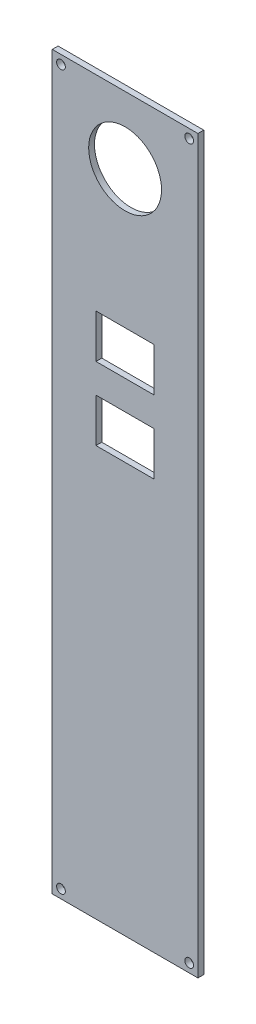
ISO-10303-21;
HEADER;
FILE_DESCRIPTION(('STEP AP214'),'2;1');
FILE_NAME('part.step','',(''),(''),'','','');
FILE_SCHEMA(('AUTOMOTIVE_DESIGN { 1 0 10303 214 1 1 1 1 }'));
ENDSEC;
DATA;
#1=APPLICATION_CONTEXT('core data for automotive mechanical design processes');
#2=APPLICATION_PROTOCOL_DEFINITION('international standard','automotive_design',2000,#1);
#3=PRODUCT_CONTEXT('',#1,'mechanical');
#4=PRODUCT('Part','Part','',(#3));
#5=PRODUCT_RELATED_PRODUCT_CATEGORY('part','',(#4));
#6=PRODUCT_DEFINITION_FORMATION('','',#4);
#7=PRODUCT_DEFINITION_CONTEXT('part definition',#1,'design');
#8=PRODUCT_DEFINITION('design','',#6,#7);
#9=PRODUCT_DEFINITION_SHAPE('','',#8);
#10=(LENGTH_UNIT() NAMED_UNIT(*) SI_UNIT(.MILLI.,.METRE.));
#11=(NAMED_UNIT(*) PLANE_ANGLE_UNIT() SI_UNIT($,.RADIAN.));
#12=(NAMED_UNIT(*) SI_UNIT($,.STERADIAN.) SOLID_ANGLE_UNIT());
#13=UNCERTAINTY_MEASURE_WITH_UNIT(LENGTH_MEASURE(1.E-05),#10,'distance_accuracy_value','');
#14=(GEOMETRIC_REPRESENTATION_CONTEXT(3) GLOBAL_UNCERTAINTY_ASSIGNED_CONTEXT((#13)) GLOBAL_UNIT_ASSIGNED_CONTEXT((#10,
#11,#12)) REPRESENTATION_CONTEXT('',''));
#15=CARTESIAN_POINT('',(0.,0.,0.));
#16=DIRECTION('',(0.,0.,1.));
#17=DIRECTION('',(1.,0.,0.));
#18=AXIS2_PLACEMENT_3D('',#15,#16,#17);
#19=CARTESIAN_POINT('',(25.,-110.746211437382,2.));
#20=DIRECTION('',(-1.,0.,0.));
#21=DIRECTION('',(0.,0.,1.));
#22=AXIS2_PLACEMENT_3D('',#19,#20,#21);
#23=PLANE('',#22);
#24=DIRECTION('',(0.,1.,0.));
#25=VECTOR('',#24,1.);
#26=CARTESIAN_POINT('',(25.,-110.746211437382,0.));
#27=LINE('',#26,#25);
#28=CARTESIAN_POINT('',(25.,-110.746211437382,0.));
#29=VERTEX_POINT('',#28);
#30=CARTESIAN_POINT('',(25.,140.253788562618,0.));
#31=VERTEX_POINT('',#30);
#32=EDGE_CURVE('E263',#29,#31,#27,.T.);
#33=ORIENTED_EDGE('',*,*,#32,.T.);
#34=DIRECTION('',(0.,0.,-1.));
#35=VECTOR('',#34,1.);
#36=CARTESIAN_POINT('',(25.,140.253788562618,2.));
#37=LINE('',#36,#35);
#38=CARTESIAN_POINT('',(25.,140.253788562618,2.));
#39=VERTEX_POINT('',#38);
#40=EDGE_CURVE('E11',#39,#31,#37,.T.);
#41=ORIENTED_EDGE('',*,*,#40,.F.);
#42=DIRECTION('',(0.,1.,0.));
#43=VECTOR('',#42,1.);
#44=CARTESIAN_POINT('',(25.,-110.746211437382,2.));
#45=LINE('',#44,#43);
#46=CARTESIAN_POINT('',(25.,-110.746211437382,2.));
#47=VERTEX_POINT('',#46);
#48=EDGE_CURVE('E267',#47,#39,#45,.T.);
#49=ORIENTED_EDGE('',*,*,#48,.F.);
#50=DIRECTION('',(0.,0.,-1.));
#51=VECTOR('',#50,1.);
#52=CARTESIAN_POINT('',(25.,-110.746211437382,2.));
#53=LINE('',#52,#51);
#54=EDGE_CURVE('E283',#47,#29,#53,.T.);
#55=ORIENTED_EDGE('',*,*,#54,.T.);
#56=EDGE_LOOP('',(#33,#41,#49,#55));
#57=FACE_BOUND('',#56,.T.);
#58=ADVANCED_FACE('F43',(#57),#23,.F.);
#59=CARTESIAN_POINT('',(25.,140.253788562618,2.));
#60=DIRECTION('',(0.,-1.,0.));
#61=DIRECTION('',(0.,0.,-1.));
#62=AXIS2_PLACEMENT_3D('',#59,#60,#61);
#63=PLANE('',#62);
#64=DIRECTION('',(-1.,0.,0.));
#65=VECTOR('',#64,1.);
#66=CARTESIAN_POINT('',(25.,140.253788562618,0.));
#67=LINE('',#66,#65);
#68=CARTESIAN_POINT('',(-25.,140.253788562618,0.));
#69=VERTEX_POINT('',#68);
#70=EDGE_CURVE('E287',#31,#69,#67,.T.);
#71=ORIENTED_EDGE('',*,*,#70,.T.);
#72=DIRECTION('',(0.,0.,-1.));
#73=VECTOR('',#72,1.);
#74=CARTESIAN_POINT('',(-25.,140.253788562618,2.));
#75=LINE('',#74,#73);
#76=CARTESIAN_POINT('',(-25.,140.253788562618,2.));
#77=VERTEX_POINT('',#76);
#78=EDGE_CURVE('E51',#77,#69,#75,.T.);
#79=ORIENTED_EDGE('',*,*,#78,.F.);
#80=DIRECTION('',(-1.,0.,0.));
#81=VECTOR('',#80,1.);
#82=CARTESIAN_POINT('',(25.,140.253788562618,2.));
#83=LINE('',#82,#81);
#84=EDGE_CURVE('E271',#39,#77,#83,.T.);
#85=ORIENTED_EDGE('',*,*,#84,.F.);
#86=ORIENTED_EDGE('',*,*,#40,.T.);
#87=EDGE_LOOP('',(#71,#79,#85,#86));
#88=FACE_BOUND('',#87,.T.);
#89=ADVANCED_FACE('F309',(#88),#63,.F.);
#90=CARTESIAN_POINT('',(-25.,-110.746211437382,2.));
#91=DIRECTION('',(-1.,0.,0.));
#92=DIRECTION('',(0.,0.,1.));
#93=AXIS2_PLACEMENT_3D('',#90,#91,#92);
#94=PLANE('',#93);
#95=DIRECTION('',(0.,1.,0.));
#96=VECTOR('',#95,1.);
#97=CARTESIAN_POINT('',(-25.,-110.746211437382,0.));
#98=LINE('',#97,#96);
#99=CARTESIAN_POINT('',(-25.,-110.746211437382,0.));
#100=VERTEX_POINT('',#99);
#101=EDGE_CURVE('E291',#100,#69,#98,.T.);
#102=ORIENTED_EDGE('',*,*,#101,.F.);
#103=DIRECTION('',(0.,0.,-1.));
#104=VECTOR('',#103,1.);
#105=CARTESIAN_POINT('',(-25.,-110.746211437382,2.));
#106=LINE('',#105,#104);
#107=CARTESIAN_POINT('',(-25.,-110.746211437382,2.));
#108=VERTEX_POINT('',#107);
#109=EDGE_CURVE('E300',#108,#100,#106,.T.);
#110=ORIENTED_EDGE('',*,*,#109,.F.);
#111=DIRECTION('',(0.,1.,0.));
#112=VECTOR('',#111,1.);
#113=CARTESIAN_POINT('',(-25.,-110.746211437382,2.));
#114=LINE('',#113,#112);
#115=EDGE_CURVE('E275',#108,#77,#114,.T.);
#116=ORIENTED_EDGE('',*,*,#115,.T.);
#117=ORIENTED_EDGE('',*,*,#78,.T.);
#118=EDGE_LOOP('',(#102,#110,#116,#117));
#119=FACE_BOUND('',#118,.T.);
#120=ADVANCED_FACE('F306',(#119),#94,.T.);
#121=CARTESIAN_POINT('',(25.,-110.746211437382,2.));
#122=DIRECTION('',(0.,-1.,0.));
#123=DIRECTION('',(0.,0.,-1.));
#124=AXIS2_PLACEMENT_3D('',#121,#122,#123);
#125=PLANE('',#124);
#126=DIRECTION('',(-1.,0.,0.));
#127=VECTOR('',#126,1.);
#128=CARTESIAN_POINT('',(25.,-110.746211437382,0.));
#129=LINE('',#128,#127);
#130=EDGE_CURVE('E272',#29,#100,#129,.T.);
#131=ORIENTED_EDGE('',*,*,#130,.F.);
#132=ORIENTED_EDGE('',*,*,#54,.F.);
#133=DIRECTION('',(-1.,0.,0.));
#134=VECTOR('',#133,1.);
#135=CARTESIAN_POINT('',(25.,-110.746211437382,2.));
#136=LINE('',#135,#134);
#137=EDGE_CURVE('E279',#47,#108,#136,.T.);
#138=ORIENTED_EDGE('',*,*,#137,.T.);
#139=ORIENTED_EDGE('',*,*,#109,.T.);
#140=EDGE_LOOP('',(#131,#132,#138,#139));
#141=FACE_BOUND('',#140,.T.);
#142=ADVANCED_FACE('F316',(#141),#125,.T.);
#143=CARTESIAN_POINT('',(0.,0.,2.));
#144=DIRECTION('',(0.,0.,1.));
#145=DIRECTION('',(1.,0.,0.));
#146=AXIS2_PLACEMENT_3D('',#143,#144,#145);
#147=PLANE('',#146);
#148=DIRECTION('',(0.,-1.,0.));
#149=VECTOR('',#148,1.);
#150=CARTESIAN_POINT('',(10.,55.,2.));
#151=LINE('',#150,#149);
#152=CARTESIAN_POINT('',(10.,70.,2.));
#153=VERTEX_POINT('',#152);
#154=CARTESIAN_POINT('',(10.,55.,2.));
#155=VERTEX_POINT('',#154);
#156=EDGE_CURVE('E136',#153,#155,#151,.T.);
#157=ORIENTED_EDGE('',*,*,#156,.T.);
#158=DIRECTION('',(-1.,0.,0.));
#159=VECTOR('',#158,1.);
#160=CARTESIAN_POINT('',(-10.,55.,2.));
#161=LINE('',#160,#159);
#162=CARTESIAN_POINT('',(-10.,55.,2.));
#163=VERTEX_POINT('',#162);
#164=EDGE_CURVE('E148',#155,#163,#161,.T.);
#165=ORIENTED_EDGE('',*,*,#164,.T.);
#166=DIRECTION('',(0.,1.,0.));
#167=VECTOR('',#166,1.);
#168=CARTESIAN_POINT('',(-10.,55.,2.));
#169=LINE('',#168,#167);
#170=CARTESIAN_POINT('',(-10.,70.,2.));
#171=VERTEX_POINT('',#170);
#172=EDGE_CURVE('E58',#163,#171,#169,.T.);
#173=ORIENTED_EDGE('',*,*,#172,.T.);
#174=DIRECTION('',(1.,0.,0.));
#175=VECTOR('',#174,1.);
#176=CARTESIAN_POINT('',(-10.,70.,2.));
#177=LINE('',#176,#175);
#178=EDGE_CURVE('E145',#171,#153,#177,.T.);
#179=ORIENTED_EDGE('',*,*,#178,.T.);
#180=EDGE_LOOP('',(#157,#165,#173,#179));
#181=FACE_BOUND('',#180,.T.);
#182=DIRECTION('',(0.,-1.,0.));
#183=VECTOR('',#182,1.);
#184=CARTESIAN_POINT('',(10.,30.,2.));
#185=LINE('',#184,#183);
#186=CARTESIAN_POINT('',(10.,45.,2.));
#187=VERTEX_POINT('',#186);
#188=CARTESIAN_POINT('',(10.,30.,2.));
#189=VERTEX_POINT('',#188);
#190=EDGE_CURVE('E205',#187,#189,#185,.T.);
#191=ORIENTED_EDGE('',*,*,#190,.T.);
#192=DIRECTION('',(-1.,0.,0.));
#193=VECTOR('',#192,1.);
#194=CARTESIAN_POINT('',(-10.,30.,2.));
#195=LINE('',#194,#193);
#196=CARTESIAN_POINT('',(-10.,30.,2.));
#197=VERTEX_POINT('',#196);
#198=EDGE_CURVE('E220',#189,#197,#195,.T.);
#199=ORIENTED_EDGE('',*,*,#198,.T.);
#200=DIRECTION('',(0.,1.,0.));
#201=VECTOR('',#200,1.);
#202=CARTESIAN_POINT('',(-10.,30.,2.));
#203=LINE('',#202,#201);
#204=CARTESIAN_POINT('',(-10.,45.,2.));
#205=VERTEX_POINT('',#204);
#206=EDGE_CURVE('E66',#197,#205,#203,.T.);
#207=ORIENTED_EDGE('',*,*,#206,.T.);
#208=DIRECTION('',(1.,0.,0.));
#209=VECTOR('',#208,1.);
#210=CARTESIAN_POINT('',(-10.,45.,2.));
#211=LINE('',#210,#209);
#212=EDGE_CURVE('E190',#205,#187,#211,.T.);
#213=ORIENTED_EDGE('',*,*,#212,.T.);
#214=EDGE_LOOP('',(#191,#199,#207,#213));
#215=FACE_BOUND('',#214,.T.);
#216=CARTESIAN_POINT('',(22.,137.253788562618,2.));
#217=DIRECTION('',(0.,0.,1.));
#218=DIRECTION('',(1.,0.,0.));
#219=AXIS2_PLACEMENT_3D('',#216,#217,#218);
#220=CIRCLE('',#219,1.5);
#221=CARTESIAN_POINT('',(23.5,137.253788562618,2.));
#222=VERTEX_POINT('',#221);
#223=EDGE_CURVE('E235',#222,#222,#220,.T.);
#224=ORIENTED_EDGE('',*,*,#223,.F.);
#225=EDGE_LOOP('',(#224));
#226=FACE_BOUND('',#225,.T.);
#227=CARTESIAN_POINT('',(-22.,-107.746211437382,2.));
#228=DIRECTION('',(0.,0.,1.));
#229=DIRECTION('',(1.,0.,0.));
#230=AXIS2_PLACEMENT_3D('',#227,#228,#229);
#231=CIRCLE('',#230,1.5);
#232=CARTESIAN_POINT('',(-20.5,-107.746211437382,2.));
#233=VERTEX_POINT('',#232);
#234=EDGE_CURVE('E244',#233,#233,#231,.T.);
#235=ORIENTED_EDGE('',*,*,#234,.F.);
#236=EDGE_LOOP('',(#235));
#237=FACE_BOUND('',#236,.T.);
#238=CARTESIAN_POINT('',(22.,-107.746211437382,2.));
#239=DIRECTION('',(0.,0.,1.));
#240=DIRECTION('',(1.,0.,0.));
#241=AXIS2_PLACEMENT_3D('',#238,#239,#240);
#242=CIRCLE('',#241,1.5);
#243=CARTESIAN_POINT('',(23.5,-107.746211437382,2.));
#244=VERTEX_POINT('',#243);
#245=EDGE_CURVE('E227',#244,#244,#242,.T.);
#246=ORIENTED_EDGE('',*,*,#245,.F.);
#247=EDGE_LOOP('',(#246));
#248=FACE_BOUND('',#247,.T.);
#249=CARTESIAN_POINT('',(-22.,137.253788562618,2.));
#250=DIRECTION('',(0.,0.,1.));
#251=DIRECTION('',(1.,0.,0.));
#252=AXIS2_PLACEMENT_3D('',#249,#250,#251);
#253=CIRCLE('',#252,1.5);
#254=CARTESIAN_POINT('',(-20.5,137.253788562618,2.));
#255=VERTEX_POINT('',#254);
#256=EDGE_CURVE('E239',#255,#255,#253,.T.);
#257=ORIENTED_EDGE('',*,*,#256,.F.);
#258=EDGE_LOOP('',(#257));
#259=FACE_BOUND('',#258,.T.);
#260=CARTESIAN_POINT('',(0.,117.253788562618,2.));
#261=DIRECTION('',(0.,0.,1.));
#262=DIRECTION('',(1.,0.,0.));
#263=AXIS2_PLACEMENT_3D('',#260,#261,#262);
#264=CIRCLE('',#263,12.5);
#265=CARTESIAN_POINT('',(12.5,117.253788562618,2.));
#266=VERTEX_POINT('',#265);
#267=EDGE_CURVE('E255',#266,#266,#264,.F.);
#268=ORIENTED_EDGE('',*,*,#267,.T.);
#269=EDGE_LOOP('',(#268));
#270=FACE_BOUND('',#269,.T.);
#271=ORIENTED_EDGE('',*,*,#48,.T.);
#272=ORIENTED_EDGE('',*,*,#84,.T.);
#273=ORIENTED_EDGE('',*,*,#115,.F.);
#274=ORIENTED_EDGE('',*,*,#137,.F.);
#275=EDGE_LOOP('',(#271,#272,#273,#274));
#276=FACE_BOUND('',#275,.T.);
#277=ADVANCED_FACE('F153',(#181,#215,#226,#237,#248,#259,#270,#276),#147,.T.);
#278=CARTESIAN_POINT('',(0.,0.,0.));
#279=DIRECTION('',(0.,0.,1.));
#280=DIRECTION('',(1.,0.,0.));
#281=AXIS2_PLACEMENT_3D('',#278,#279,#280);
#282=PLANE('',#281);
#283=DIRECTION('',(-1.,0.,0.));
#284=VECTOR('',#283,1.);
#285=CARTESIAN_POINT('',(-10.,55.,0.));
#286=LINE('',#285,#284);
#287=CARTESIAN_POINT('',(10.,55.,0.));
#288=VERTEX_POINT('',#287);
#289=CARTESIAN_POINT('',(-10.,55.,0.));
#290=VERTEX_POINT('',#289);
#291=EDGE_CURVE('E170',#288,#290,#286,.T.);
#292=ORIENTED_EDGE('',*,*,#291,.F.);
#293=DIRECTION('',(0.,-1.,0.));
#294=VECTOR('',#293,1.);
#295=CARTESIAN_POINT('',(10.,55.,0.));
#296=LINE('',#295,#294);
#297=CARTESIAN_POINT('',(10.,70.,0.));
#298=VERTEX_POINT('',#297);
#299=EDGE_CURVE('E139',#298,#288,#296,.T.);
#300=ORIENTED_EDGE('',*,*,#299,.F.);
#301=DIRECTION('',(1.,0.,0.));
#302=VECTOR('',#301,1.);
#303=CARTESIAN_POINT('',(-10.,70.,0.));
#304=LINE('',#303,#302);
#305=CARTESIAN_POINT('',(-10.,70.,0.));
#306=VERTEX_POINT('',#305);
#307=EDGE_CURVE('E157',#306,#298,#304,.T.);
#308=ORIENTED_EDGE('',*,*,#307,.F.);
#309=DIRECTION('',(0.,1.,0.));
#310=VECTOR('',#309,1.);
#311=CARTESIAN_POINT('',(-10.,55.,0.));
#312=LINE('',#311,#310);
#313=EDGE_CURVE('E161',#290,#306,#312,.T.);
#314=ORIENTED_EDGE('',*,*,#313,.F.);
#315=EDGE_LOOP('',(#292,#300,#308,#314));
#316=FACE_BOUND('',#315,.T.);
#317=DIRECTION('',(-1.,0.,0.));
#318=VECTOR('',#317,1.);
#319=CARTESIAN_POINT('',(-10.,30.,0.));
#320=LINE('',#319,#318);
#321=CARTESIAN_POINT('',(10.,30.,0.));
#322=VERTEX_POINT('',#321);
#323=CARTESIAN_POINT('',(-10.,30.,0.));
#324=VERTEX_POINT('',#323);
#325=EDGE_CURVE('E209',#322,#324,#320,.T.);
#326=ORIENTED_EDGE('',*,*,#325,.F.);
#327=DIRECTION('',(0.,-1.,0.));
#328=VECTOR('',#327,1.);
#329=CARTESIAN_POINT('',(10.,30.,0.));
#330=LINE('',#329,#328);
#331=CARTESIAN_POINT('',(10.,45.,0.));
#332=VERTEX_POINT('',#331);
#333=EDGE_CURVE('E171',#332,#322,#330,.T.);
#334=ORIENTED_EDGE('',*,*,#333,.F.);
#335=DIRECTION('',(1.,0.,0.));
#336=VECTOR('',#335,1.);
#337=CARTESIAN_POINT('',(-10.,45.,0.));
#338=LINE('',#337,#336);
#339=CARTESIAN_POINT('',(-10.,45.,0.));
#340=VERTEX_POINT('',#339);
#341=EDGE_CURVE('E200',#340,#332,#338,.T.);
#342=ORIENTED_EDGE('',*,*,#341,.F.);
#343=DIRECTION('',(0.,1.,0.));
#344=VECTOR('',#343,1.);
#345=CARTESIAN_POINT('',(-10.,30.,0.));
#346=LINE('',#345,#344);
#347=EDGE_CURVE('E204',#324,#340,#346,.T.);
#348=ORIENTED_EDGE('',*,*,#347,.F.);
#349=EDGE_LOOP('',(#326,#334,#342,#348));
#350=FACE_BOUND('',#349,.T.);
#351=CARTESIAN_POINT('',(22.,137.253788562618,0.));
#352=DIRECTION('',(0.,0.,1.));
#353=DIRECTION('',(1.,0.,0.));
#354=AXIS2_PLACEMENT_3D('',#351,#352,#353);
#355=CIRCLE('',#354,1.5);
#356=CARTESIAN_POINT('',(23.5,137.253788562618,0.));
#357=VERTEX_POINT('',#356);
#358=EDGE_CURVE('E240',#357,#357,#355,.T.);
#359=ORIENTED_EDGE('',*,*,#358,.T.);
#360=EDGE_LOOP('',(#359));
#361=FACE_BOUND('',#360,.T.);
#362=CARTESIAN_POINT('',(-22.,-107.746211437382,0.));
#363=DIRECTION('',(0.,0.,1.));
#364=DIRECTION('',(1.,0.,0.));
#365=AXIS2_PLACEMENT_3D('',#362,#363,#364);
#366=CIRCLE('',#365,1.5);
#367=CARTESIAN_POINT('',(-20.5,-107.746211437382,0.));
#368=VERTEX_POINT('',#367);
#369=EDGE_CURVE('E231',#368,#368,#366,.T.);
#370=ORIENTED_EDGE('',*,*,#369,.T.);
#371=EDGE_LOOP('',(#370));
#372=FACE_BOUND('',#371,.T.);
#373=CARTESIAN_POINT('',(22.,-107.746211437382,0.));
#374=DIRECTION('',(0.,0.,1.));
#375=DIRECTION('',(1.,0.,0.));
#376=AXIS2_PLACEMENT_3D('',#373,#374,#375);
#377=CIRCLE('',#376,1.5);
#378=CARTESIAN_POINT('',(23.5,-107.746211437382,0.));
#379=VERTEX_POINT('',#378);
#380=EDGE_CURVE('E180',#379,#379,#377,.T.);
#381=ORIENTED_EDGE('',*,*,#380,.T.);
#382=EDGE_LOOP('',(#381));
#383=FACE_BOUND('',#382,.T.);
#384=CARTESIAN_POINT('',(-22.,137.253788562618,0.));
#385=DIRECTION('',(0.,0.,1.));
#386=DIRECTION('',(1.,0.,0.));
#387=AXIS2_PLACEMENT_3D('',#384,#385,#386);
#388=CIRCLE('',#387,1.5);
#389=CARTESIAN_POINT('',(-20.5,137.253788562618,0.));
#390=VERTEX_POINT('',#389);
#391=EDGE_CURVE('E251',#390,#390,#388,.T.);
#392=ORIENTED_EDGE('',*,*,#391,.T.);
#393=EDGE_LOOP('',(#392));
#394=FACE_BOUND('',#393,.T.);
#395=CARTESIAN_POINT('',(0.,117.253788562618,0.));
#396=DIRECTION('',(0.,0.,-1.));
#397=DIRECTION('',(-1.,0.,0.));
#398=AXIS2_PLACEMENT_3D('',#395,#396,#397);
#399=CIRCLE('',#398,12.5);
#400=CARTESIAN_POINT('',(-12.5,117.253788562618,0.));
#401=VERTEX_POINT('',#400);
#402=EDGE_CURVE('E259',#401,#401,#399,.T.);
#403=ORIENTED_EDGE('',*,*,#402,.F.);
#404=EDGE_LOOP('',(#403));
#405=FACE_BOUND('',#404,.T.);
#406=ORIENTED_EDGE('',*,*,#32,.F.);
#407=ORIENTED_EDGE('',*,*,#130,.T.);
#408=ORIENTED_EDGE('',*,*,#101,.T.);
#409=ORIENTED_EDGE('',*,*,#70,.F.);
#410=EDGE_LOOP('',(#406,#407,#408,#409));
#411=FACE_BOUND('',#410,.T.);
#412=ADVANCED_FACE('F313',(#316,#350,#361,#372,#383,#394,#405,#411),#282,.F.);
#413=CARTESIAN_POINT('',(0.,117.253788562618,2.001));
#414=DIRECTION('',(0.,0.,-1.));
#415=DIRECTION('',(-1.,0.,0.));
#416=AXIS2_PLACEMENT_3D('',#413,#414,#415);
#417=CYLINDRICAL_SURFACE('',#416,12.5);
#418=ORIENTED_EDGE('',*,*,#267,.F.);
#419=EDGE_LOOP('',(#418));
#420=FACE_BOUND('',#419,.T.);
#421=ORIENTED_EDGE('',*,*,#402,.T.);
#422=EDGE_LOOP('',(#421));
#423=FACE_BOUND('',#422,.T.);
#424=ADVANCED_FACE('F334',(#420,#423),#417,.F.);
#425=CARTESIAN_POINT('',(-22.,137.253788562618,0.));
#426=DIRECTION('',(0.,0.,1.));
#427=DIRECTION('',(1.,0.,0.));
#428=AXIS2_PLACEMENT_3D('',#425,#426,#427);
#429=CYLINDRICAL_SURFACE('',#428,1.5);
#430=ORIENTED_EDGE('',*,*,#391,.F.);
#431=EDGE_LOOP('',(#430));
#432=FACE_BOUND('',#431,.T.);
#433=ORIENTED_EDGE('',*,*,#256,.T.);
#434=EDGE_LOOP('',(#433));
#435=FACE_BOUND('',#434,.T.);
#436=ADVANCED_FACE('F340',(#432,#435),#429,.F.);
#437=CARTESIAN_POINT('',(22.,-107.746211437382,0.));
#438=DIRECTION('',(0.,0.,1.));
#439=DIRECTION('',(1.,0.,0.));
#440=AXIS2_PLACEMENT_3D('',#437,#438,#439);
#441=CYLINDRICAL_SURFACE('',#440,1.5);
#442=ORIENTED_EDGE('',*,*,#380,.F.);
#443=EDGE_LOOP('',(#442));
#444=FACE_BOUND('',#443,.T.);
#445=ORIENTED_EDGE('',*,*,#245,.T.);
#446=EDGE_LOOP('',(#445));
#447=FACE_BOUND('',#446,.T.);
#448=ADVANCED_FACE('F344',(#444,#447),#441,.F.);
#449=CARTESIAN_POINT('',(-22.,-107.746211437382,0.));
#450=DIRECTION('',(0.,0.,1.));
#451=DIRECTION('',(1.,0.,0.));
#452=AXIS2_PLACEMENT_3D('',#449,#450,#451);
#453=CYLINDRICAL_SURFACE('',#452,1.5);
#454=ORIENTED_EDGE('',*,*,#369,.F.);
#455=EDGE_LOOP('',(#454));
#456=FACE_BOUND('',#455,.T.);
#457=ORIENTED_EDGE('',*,*,#234,.T.);
#458=EDGE_LOOP('',(#457));
#459=FACE_BOUND('',#458,.T.);
#460=ADVANCED_FACE('F346',(#456,#459),#453,.F.);
#461=CARTESIAN_POINT('',(22.,137.253788562618,0.));
#462=DIRECTION('',(0.,0.,1.));
#463=DIRECTION('',(1.,0.,0.));
#464=AXIS2_PLACEMENT_3D('',#461,#462,#463);
#465=CYLINDRICAL_SURFACE('',#464,1.5);
#466=ORIENTED_EDGE('',*,*,#358,.F.);
#467=EDGE_LOOP('',(#466));
#468=FACE_BOUND('',#467,.T.);
#469=ORIENTED_EDGE('',*,*,#223,.T.);
#470=EDGE_LOOP('',(#469));
#471=FACE_BOUND('',#470,.T.);
#472=ADVANCED_FACE('F349',(#468,#471),#465,.F.);
#473=CARTESIAN_POINT('',(10.,30.,2.));
#474=DIRECTION('',(1.,0.,0.));
#475=DIRECTION('',(0.,1.,0.));
#476=AXIS2_PLACEMENT_3D('',#473,#474,#475);
#477=PLANE('',#476);
#478=ORIENTED_EDGE('',*,*,#333,.T.);
#479=DIRECTION('',(0.,0.,-1.));
#480=VECTOR('',#479,1.);
#481=CARTESIAN_POINT('',(10.,30.,2.));
#482=LINE('',#481,#480);
#483=EDGE_CURVE('E186',#189,#322,#482,.T.);
#484=ORIENTED_EDGE('',*,*,#483,.F.);
#485=ORIENTED_EDGE('',*,*,#190,.F.);
#486=DIRECTION('',(0.,0.,-1.));
#487=VECTOR('',#486,1.);
#488=CARTESIAN_POINT('',(10.,45.,2.));
#489=LINE('',#488,#487);
#490=EDGE_CURVE('E197',#187,#332,#489,.T.);
#491=ORIENTED_EDGE('',*,*,#490,.T.);
#492=EDGE_LOOP('',(#478,#484,#485,#491));
#493=FACE_BOUND('',#492,.T.);
#494=ADVANCED_FACE('F353',(#493),#477,.F.);
#495=CARTESIAN_POINT('',(-10.,45.,2.));
#496=DIRECTION('',(0.,1.,0.));
#497=DIRECTION('',(0.,0.,1.));
#498=AXIS2_PLACEMENT_3D('',#495,#496,#497);
#499=PLANE('',#498);
#500=ORIENTED_EDGE('',*,*,#341,.T.);
#501=ORIENTED_EDGE('',*,*,#490,.F.);
#502=ORIENTED_EDGE('',*,*,#212,.F.);
#503=DIRECTION('',(0.,0.,-1.));
#504=VECTOR('',#503,1.);
#505=CARTESIAN_POINT('',(-10.,45.,2.));
#506=LINE('',#505,#504);
#507=EDGE_CURVE('E194',#205,#340,#506,.T.);
#508=ORIENTED_EDGE('',*,*,#507,.T.);
#509=EDGE_LOOP('',(#500,#501,#502,#508));
#510=FACE_BOUND('',#509,.T.);
#511=ADVANCED_FACE('F358',(#510),#499,.F.);
#512=CARTESIAN_POINT('',(-10.,30.,2.));
#513=DIRECTION('',(-1.,0.,0.));
#514=DIRECTION('',(0.,-1.,0.));
#515=AXIS2_PLACEMENT_3D('',#512,#513,#514);
#516=PLANE('',#515);
#517=ORIENTED_EDGE('',*,*,#347,.T.);
#518=ORIENTED_EDGE('',*,*,#507,.F.);
#519=ORIENTED_EDGE('',*,*,#206,.F.);
#520=DIRECTION('',(0.,0.,-1.));
#521=VECTOR('',#520,1.);
#522=CARTESIAN_POINT('',(-10.,30.,2.));
#523=LINE('',#522,#521);
#524=EDGE_CURVE('E191',#197,#324,#523,.T.);
#525=ORIENTED_EDGE('',*,*,#524,.T.);
#526=EDGE_LOOP('',(#517,#518,#519,#525));
#527=FACE_BOUND('',#526,.T.);
#528=ADVANCED_FACE('F361',(#527),#516,.F.);
#529=CARTESIAN_POINT('',(-10.,30.,2.));
#530=DIRECTION('',(0.,-1.,0.));
#531=DIRECTION('',(0.,0.,-1.));
#532=AXIS2_PLACEMENT_3D('',#529,#530,#531);
#533=PLANE('',#532);
#534=ORIENTED_EDGE('',*,*,#325,.T.);
#535=ORIENTED_EDGE('',*,*,#524,.F.);
#536=ORIENTED_EDGE('',*,*,#198,.F.);
#537=ORIENTED_EDGE('',*,*,#483,.T.);
#538=EDGE_LOOP('',(#534,#535,#536,#537));
#539=FACE_BOUND('',#538,.T.);
#540=ADVANCED_FACE('F365',(#539),#533,.F.);
#541=CARTESIAN_POINT('',(10.,55.,2.));
#542=DIRECTION('',(1.,0.,0.));
#543=DIRECTION('',(0.,0.,-1.));
#544=AXIS2_PLACEMENT_3D('',#541,#542,#543);
#545=PLANE('',#544);
#546=ORIENTED_EDGE('',*,*,#299,.T.);
#547=DIRECTION('',(0.,0.,-1.));
#548=VECTOR('',#547,1.);
#549=CARTESIAN_POINT('',(10.,55.,2.));
#550=LINE('',#549,#548);
#551=EDGE_CURVE('E132',#155,#288,#550,.T.);
#552=ORIENTED_EDGE('',*,*,#551,.F.);
#553=ORIENTED_EDGE('',*,*,#156,.F.);
#554=DIRECTION('',(0.,0.,-1.));
#555=VECTOR('',#554,1.);
#556=CARTESIAN_POINT('',(10.,70.,2.));
#557=LINE('',#556,#555);
#558=EDGE_CURVE('E177',#153,#298,#557,.T.);
#559=ORIENTED_EDGE('',*,*,#558,.T.);
#560=EDGE_LOOP('',(#546,#552,#553,#559));
#561=FACE_BOUND('',#560,.T.);
#562=ADVANCED_FACE('F134',(#561),#545,.F.);
#563=CARTESIAN_POINT('',(-10.,70.,2.));
#564=DIRECTION('',(0.,1.,0.));
#565=DIRECTION('',(0.,0.,1.));
#566=AXIS2_PLACEMENT_3D('',#563,#564,#565);
#567=PLANE('',#566);
#568=ORIENTED_EDGE('',*,*,#307,.T.);
#569=ORIENTED_EDGE('',*,*,#558,.F.);
#570=ORIENTED_EDGE('',*,*,#178,.F.);
#571=DIRECTION('',(0.,0.,-1.));
#572=VECTOR('',#571,1.);
#573=CARTESIAN_POINT('',(-10.,70.,2.));
#574=LINE('',#573,#572);
#575=EDGE_CURVE('E181',#171,#306,#574,.T.);
#576=ORIENTED_EDGE('',*,*,#575,.T.);
#577=EDGE_LOOP('',(#568,#569,#570,#576));
#578=FACE_BOUND('',#577,.T.);
#579=ADVANCED_FACE('F374',(#578),#567,.F.);
#580=CARTESIAN_POINT('',(-10.,55.,2.));
#581=DIRECTION('',(-1.,0.,0.));
#582=DIRECTION('',(0.,0.,1.));
#583=AXIS2_PLACEMENT_3D('',#580,#581,#582);
#584=PLANE('',#583);
#585=ORIENTED_EDGE('',*,*,#313,.T.);
#586=ORIENTED_EDGE('',*,*,#575,.F.);
#587=ORIENTED_EDGE('',*,*,#172,.F.);
#588=DIRECTION('',(0.,0.,-1.));
#589=VECTOR('',#588,1.);
#590=CARTESIAN_POINT('',(-10.,55.,2.));
#591=LINE('',#590,#589);
#592=EDGE_CURVE('E144',#163,#290,#591,.T.);
#593=ORIENTED_EDGE('',*,*,#592,.T.);
#594=EDGE_LOOP('',(#585,#586,#587,#593));
#595=FACE_BOUND('',#594,.T.);
#596=ADVANCED_FACE('F377',(#595),#584,.F.);
#597=CARTESIAN_POINT('',(-10.,55.,2.));
#598=DIRECTION('',(0.,-1.,0.));
#599=DIRECTION('',(0.,0.,-1.));
#600=AXIS2_PLACEMENT_3D('',#597,#598,#599);
#601=PLANE('',#600);
#602=ORIENTED_EDGE('',*,*,#291,.T.);
#603=ORIENTED_EDGE('',*,*,#592,.F.);
#604=ORIENTED_EDGE('',*,*,#164,.F.);
#605=ORIENTED_EDGE('',*,*,#551,.T.);
#606=EDGE_LOOP('',(#602,#603,#604,#605));
#607=FACE_BOUND('',#606,.T.);
#608=ADVANCED_FACE('F149',(#607),#601,.F.);
#609=CLOSED_SHELL('',(#58,#89,#120,#142,#277,#412,#424,#436,#448,#460,#472,#494,#511,#528,#540,
#562,#579,#596,#608));
#610=MANIFOLD_SOLID_BREP('B2',#609);
#611=ADVANCED_BREP_SHAPE_REPRESENTATION('',(#18,#610),#14);
#612=SHAPE_DEFINITION_REPRESENTATION(#9,#611);
ENDSEC;
END-ISO-10303-21;
